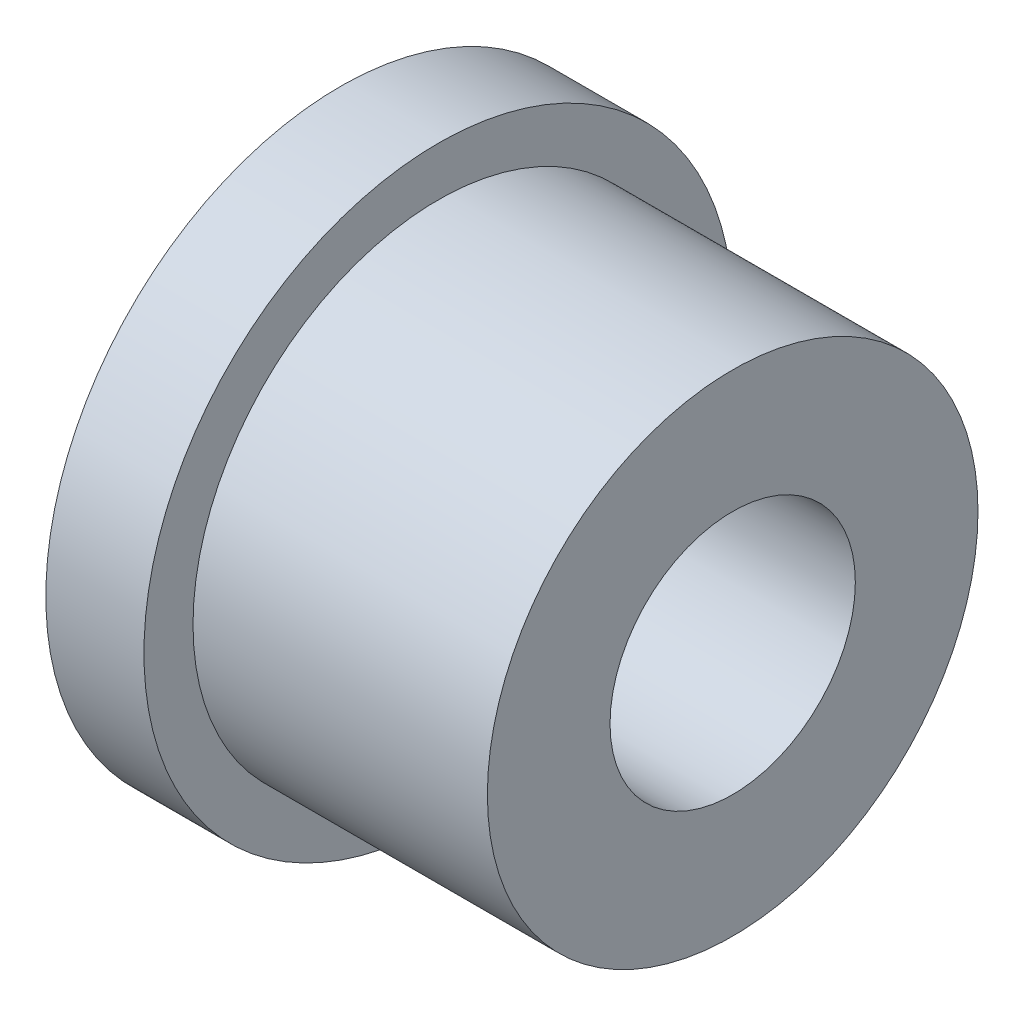
ISO-10303-21;
HEADER;
FILE_DESCRIPTION(('STEP AP214'),'2;1');
FILE_NAME('part.step','',(''),(''),'','','');
FILE_SCHEMA(('AUTOMOTIVE_DESIGN { 1 0 10303 214 1 1 1 1 }'));
ENDSEC;
DATA;
#1=APPLICATION_CONTEXT('core data for automotive mechanical design processes');
#2=APPLICATION_PROTOCOL_DEFINITION('international standard','automotive_design',2000,#1);
#3=PRODUCT_CONTEXT('',#1,'mechanical');
#4=PRODUCT('Part','Part','',(#3));
#5=PRODUCT_RELATED_PRODUCT_CATEGORY('part','',(#4));
#6=PRODUCT_DEFINITION_FORMATION('','',#4);
#7=PRODUCT_DEFINITION_CONTEXT('part definition',#1,'design');
#8=PRODUCT_DEFINITION('design','',#6,#7);
#9=PRODUCT_DEFINITION_SHAPE('','',#8);
#10=(LENGTH_UNIT() NAMED_UNIT(*) SI_UNIT(.MILLI.,.METRE.));
#11=(NAMED_UNIT(*) PLANE_ANGLE_UNIT() SI_UNIT($,.RADIAN.));
#12=(NAMED_UNIT(*) SI_UNIT($,.STERADIAN.) SOLID_ANGLE_UNIT());
#13=UNCERTAINTY_MEASURE_WITH_UNIT(LENGTH_MEASURE(1.E-05),#10,'distance_accuracy_value','');
#14=(GEOMETRIC_REPRESENTATION_CONTEXT(3) GLOBAL_UNCERTAINTY_ASSIGNED_CONTEXT((#13)) GLOBAL_UNIT_ASSIGNED_CONTEXT((#10,
#11,#12)) REPRESENTATION_CONTEXT('',''));
#15=CARTESIAN_POINT('',(0.,0.,0.));
#16=DIRECTION('',(0.,0.,1.));
#17=DIRECTION('',(1.,0.,0.));
#18=AXIS2_PLACEMENT_3D('',#15,#16,#17);
#19=CARTESIAN_POINT('',(2.,0.,0.));
#20=DIRECTION('',(1.,0.,0.));
#21=DIRECTION('',(0.,0.,-1.));
#22=AXIS2_PLACEMENT_3D('',#19,#20,#21);
#23=PLANE('',#22);
#24=CARTESIAN_POINT('',(2.,0.,0.));
#25=DIRECTION('',(1.,0.,0.));
#26=DIRECTION('',(0.,0.,-1.));
#27=AXIS2_PLACEMENT_3D('',#24,#25,#26);
#28=CIRCLE('',#27,6.);
#29=CARTESIAN_POINT('',(2.,0.,-6.));
#30=VERTEX_POINT('',#29);
#31=EDGE_CURVE('E10',#30,#30,#28,.T.);
#32=ORIENTED_EDGE('',*,*,#31,.T.);
#33=EDGE_LOOP('',(#32));
#34=FACE_BOUND('',#33,.T.);
#35=CARTESIAN_POINT('',(2.,0.,0.));
#36=DIRECTION('',(1.,0.,0.));
#37=DIRECTION('',(0.,0.,-1.));
#38=AXIS2_PLACEMENT_3D('',#35,#36,#37);
#39=CIRCLE('',#38,5.);
#40=CARTESIAN_POINT('',(2.,0.,-5.));
#41=VERTEX_POINT('',#40);
#42=EDGE_CURVE('E51',#41,#41,#39,.T.);
#43=ORIENTED_EDGE('',*,*,#42,.F.);
#44=EDGE_LOOP('',(#43));
#45=FACE_BOUND('',#44,.T.);
#46=ADVANCED_FACE('F35',(#34,#45),#23,.T.);
#47=CARTESIAN_POINT('',(0.,0.,0.));
#48=DIRECTION('',(1.,0.,0.));
#49=DIRECTION('',(0.,0.,-1.));
#50=AXIS2_PLACEMENT_3D('',#47,#48,#49);
#51=PLANE('',#50);
#52=CARTESIAN_POINT('',(0.,0.,0.));
#53=DIRECTION('',(1.,0.,0.));
#54=DIRECTION('',(0.,0.,-1.));
#55=AXIS2_PLACEMENT_3D('',#52,#53,#54);
#56=CIRCLE('',#55,6.);
#57=CARTESIAN_POINT('',(0.,0.,-6.));
#58=VERTEX_POINT('',#57);
#59=EDGE_CURVE('E39',#58,#58,#56,.T.);
#60=ORIENTED_EDGE('',*,*,#59,.F.);
#61=EDGE_LOOP('',(#60));
#62=FACE_BOUND('',#61,.T.);
#63=CARTESIAN_POINT('',(0.,0.,0.));
#64=DIRECTION('',(1.,0.,0.));
#65=DIRECTION('',(0.,0.,-1.));
#66=AXIS2_PLACEMENT_3D('',#63,#64,#65);
#67=CIRCLE('',#66,2.5);
#68=CARTESIAN_POINT('',(0.,0.,-2.5));
#69=VERTEX_POINT('',#68);
#70=EDGE_CURVE('E46',#69,#69,#67,.T.);
#71=ORIENTED_EDGE('',*,*,#70,.T.);
#72=EDGE_LOOP('',(#71));
#73=FACE_BOUND('',#72,.T.);
#74=ADVANCED_FACE('F76',(#62,#73),#51,.F.);
#75=CARTESIAN_POINT('',(2.,0.,0.));
#76=DIRECTION('',(-1.,0.,0.));
#77=DIRECTION('',(0.,0.,1.));
#78=AXIS2_PLACEMENT_3D('',#75,#76,#77);
#79=CYLINDRICAL_SURFACE('',#78,6.);
#80=ORIENTED_EDGE('',*,*,#31,.F.);
#81=EDGE_LOOP('',(#80));
#82=FACE_BOUND('',#81,.T.);
#83=ORIENTED_EDGE('',*,*,#59,.T.);
#84=EDGE_LOOP('',(#83));
#85=FACE_BOUND('',#84,.T.);
#86=ADVANCED_FACE('F37',(#82,#85),#79,.T.);
#87=CARTESIAN_POINT('',(2.,0.,0.));
#88=DIRECTION('',(-1.,0.,0.));
#89=DIRECTION('',(0.,0.,1.));
#90=AXIS2_PLACEMENT_3D('',#87,#88,#89);
#91=CYLINDRICAL_SURFACE('',#90,2.5);
#92=ORIENTED_EDGE('',*,*,#70,.F.);
#93=EDGE_LOOP('',(#92));
#94=FACE_BOUND('',#93,.T.);
#95=CARTESIAN_POINT('',(8.,0.,0.));
#96=DIRECTION('',(1.,0.,0.));
#97=DIRECTION('',(0.,0.,-1.));
#98=AXIS2_PLACEMENT_3D('',#95,#96,#97);
#99=CIRCLE('',#98,2.5);
#100=CARTESIAN_POINT('',(8.,0.,-2.5));
#101=VERTEX_POINT('',#100);
#102=EDGE_CURVE('E54',#101,#101,#99,.T.);
#103=ORIENTED_EDGE('',*,*,#102,.T.);
#104=EDGE_LOOP('',(#103));
#105=FACE_BOUND('',#104,.T.);
#106=ADVANCED_FACE('F60',(#94,#105),#91,.F.);
#107=CARTESIAN_POINT('',(8.,0.,0.));
#108=DIRECTION('',(1.,0.,0.));
#109=DIRECTION('',(0.,0.,-1.));
#110=AXIS2_PLACEMENT_3D('',#107,#108,#109);
#111=PLANE('',#110);
#112=CARTESIAN_POINT('',(8.,0.,0.));
#113=DIRECTION('',(1.,0.,0.));
#114=DIRECTION('',(0.,0.,-1.));
#115=AXIS2_PLACEMENT_3D('',#112,#113,#114);
#116=CIRCLE('',#115,5.);
#117=CARTESIAN_POINT('',(8.,0.,-5.));
#118=VERTEX_POINT('',#117);
#119=EDGE_CURVE('E50',#118,#118,#116,.T.);
#120=ORIENTED_EDGE('',*,*,#119,.T.);
#121=EDGE_LOOP('',(#120));
#122=FACE_BOUND('',#121,.T.);
#123=ORIENTED_EDGE('',*,*,#102,.F.);
#124=EDGE_LOOP('',(#123));
#125=FACE_BOUND('',#124,.T.);
#126=ADVANCED_FACE('F62',(#122,#125),#111,.T.);
#127=CARTESIAN_POINT('',(8.,0.,0.));
#128=DIRECTION('',(-1.,0.,0.));
#129=DIRECTION('',(0.,0.,1.));
#130=AXIS2_PLACEMENT_3D('',#127,#128,#129);
#131=CYLINDRICAL_SURFACE('',#130,5.);
#132=ORIENTED_EDGE('',*,*,#119,.F.);
#133=EDGE_LOOP('',(#132));
#134=FACE_BOUND('',#133,.T.);
#135=ORIENTED_EDGE('',*,*,#42,.T.);
#136=EDGE_LOOP('',(#135));
#137=FACE_BOUND('',#136,.T.);
#138=ADVANCED_FACE('F64',(#134,#137),#131,.T.);
#139=CLOSED_SHELL('',(#46,#74,#86,#106,#126,#138));
#140=MANIFOLD_SOLID_BREP('B2',#139);
#141=ADVANCED_BREP_SHAPE_REPRESENTATION('',(#18,#140),#14);
#142=SHAPE_DEFINITION_REPRESENTATION(#9,#141);
ENDSEC;
END-ISO-10303-21;
